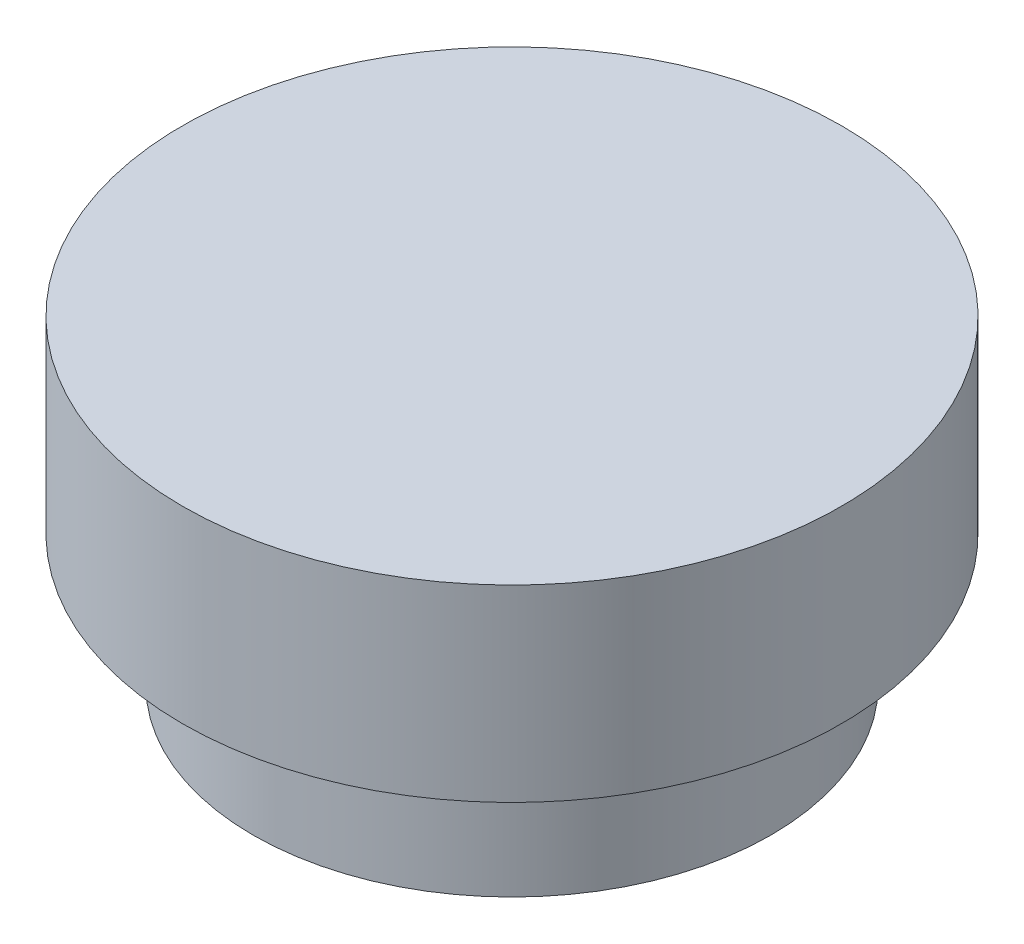
ISO-10303-21;
HEADER;
FILE_DESCRIPTION(('STEP AP214'),'2;1');
FILE_NAME('part.step','',(''),(''),'','','');
FILE_SCHEMA(('AUTOMOTIVE_DESIGN { 1 0 10303 214 1 1 1 1 }'));
ENDSEC;
DATA;
#1=APPLICATION_CONTEXT('core data for automotive mechanical design processes');
#2=APPLICATION_PROTOCOL_DEFINITION('international standard','automotive_design',2000,#1);
#3=PRODUCT_CONTEXT('',#1,'mechanical');
#4=PRODUCT('Part','Part','',(#3));
#5=PRODUCT_RELATED_PRODUCT_CATEGORY('part','',(#4));
#6=PRODUCT_DEFINITION_FORMATION('','',#4);
#7=PRODUCT_DEFINITION_CONTEXT('part definition',#1,'design');
#8=PRODUCT_DEFINITION('design','',#6,#7);
#9=PRODUCT_DEFINITION_SHAPE('','',#8);
#10=(LENGTH_UNIT() NAMED_UNIT(*) SI_UNIT(.MILLI.,.METRE.));
#11=(NAMED_UNIT(*) PLANE_ANGLE_UNIT() SI_UNIT($,.RADIAN.));
#12=(NAMED_UNIT(*) SI_UNIT($,.STERADIAN.) SOLID_ANGLE_UNIT());
#13=UNCERTAINTY_MEASURE_WITH_UNIT(LENGTH_MEASURE(1.E-05),#10,'distance_accuracy_value','');
#14=(GEOMETRIC_REPRESENTATION_CONTEXT(3) GLOBAL_UNCERTAINTY_ASSIGNED_CONTEXT((#13)) GLOBAL_UNIT_ASSIGNED_CONTEXT((#10,
#11,#12)) REPRESENTATION_CONTEXT('',''));
#15=CARTESIAN_POINT('',(0.,0.,0.));
#16=DIRECTION('',(0.,0.,1.));
#17=DIRECTION('',(1.,0.,0.));
#18=AXIS2_PLACEMENT_3D('',#15,#16,#17);
#19=CARTESIAN_POINT('',(0.,10.,0.));
#20=DIRECTION('',(0.,-1.,0.));
#21=DIRECTION('',(0.,0.,-1.));
#22=AXIS2_PLACEMENT_3D('',#19,#20,#21);
#23=CYLINDRICAL_SURFACE('',#22,5.);
#24=CARTESIAN_POINT('',(0.,10.,0.));
#25=DIRECTION('',(0.,1.,0.));
#26=DIRECTION('',(0.,0.,1.));
#27=AXIS2_PLACEMENT_3D('',#24,#25,#26);
#28=CIRCLE('',#27,5.);
#29=CARTESIAN_POINT('',(0.,10.,5.));
#30=VERTEX_POINT('',#29);
#31=EDGE_CURVE('E10',#30,#30,#28,.T.);
#32=ORIENTED_EDGE('',*,*,#31,.F.);
#33=EDGE_LOOP('',(#32));
#34=FACE_BOUND('',#33,.T.);
#35=CARTESIAN_POINT('',(0.,0.,0.));
#36=DIRECTION('',(0.,1.,0.));
#37=DIRECTION('',(0.,0.,1.));
#38=AXIS2_PLACEMENT_3D('',#35,#36,#37);
#39=CIRCLE('',#38,5.);
#40=CARTESIAN_POINT('',(0.,0.,5.));
#41=VERTEX_POINT('',#40);
#42=EDGE_CURVE('E34',#41,#41,#39,.T.);
#43=ORIENTED_EDGE('',*,*,#42,.T.);
#44=EDGE_LOOP('',(#43));
#45=FACE_BOUND('',#44,.T.);
#46=ADVANCED_FACE('F31',(#34,#45),#23,.T.);
#47=CARTESIAN_POINT('',(0.,0.,0.));
#48=DIRECTION('',(0.,1.,0.));
#49=DIRECTION('',(0.,0.,1.));
#50=AXIS2_PLACEMENT_3D('',#47,#48,#49);
#51=PLANE('',#50);
#52=ORIENTED_EDGE('',*,*,#42,.F.);
#53=EDGE_LOOP('',(#52));
#54=FACE_BOUND('',#53,.T.);
#55=ADVANCED_FACE('F73',(#54),#51,.F.);
#56=CARTESIAN_POINT('',(0.,24.,0.));
#57=DIRECTION('',(0.,-1.,0.));
#58=DIRECTION('',(0.,0.,-1.));
#59=AXIS2_PLACEMENT_3D('',#56,#57,#58);
#60=CYLINDRICAL_SURFACE('',#59,27.5);
#61=CARTESIAN_POINT('',(0.,24.,0.));
#62=DIRECTION('',(0.,1.,0.));
#63=DIRECTION('',(0.,0.,1.));
#64=AXIS2_PLACEMENT_3D('',#61,#62,#63);
#65=CIRCLE('',#64,27.5);
#66=CARTESIAN_POINT('',(0.,24.,27.5));
#67=VERTEX_POINT('',#66);
#68=EDGE_CURVE('E41',#67,#67,#65,.T.);
#69=ORIENTED_EDGE('',*,*,#68,.F.);
#70=EDGE_LOOP('',(#69));
#71=FACE_BOUND('',#70,.T.);
#72=CARTESIAN_POINT('',(0.,10.,0.));
#73=DIRECTION('',(0.,1.,0.));
#74=DIRECTION('',(0.,0.,1.));
#75=AXIS2_PLACEMENT_3D('',#72,#73,#74);
#76=CIRCLE('',#75,27.5);
#77=CARTESIAN_POINT('',(0.,10.,27.5));
#78=VERTEX_POINT('',#77);
#79=EDGE_CURVE('E43',#78,#78,#76,.T.);
#80=ORIENTED_EDGE('',*,*,#79,.T.);
#81=EDGE_LOOP('',(#80));
#82=FACE_BOUND('',#81,.T.);
#83=ADVANCED_FACE('F78',(#71,#82),#60,.T.);
#84=CARTESIAN_POINT('',(0.,10.,0.));
#85=DIRECTION('',(0.,1.,0.));
#86=DIRECTION('',(0.,0.,1.));
#87=AXIS2_PLACEMENT_3D('',#84,#85,#86);
#88=PLANE('',#87);
#89=ORIENTED_EDGE('',*,*,#31,.T.);
#90=EDGE_LOOP('',(#89));
#91=FACE_BOUND('',#90,.T.);
#92=ORIENTED_EDGE('',*,*,#79,.F.);
#93=EDGE_LOOP('',(#92));
#94=FACE_BOUND('',#93,.T.);
#95=ADVANCED_FACE('F60',(#91,#94),#88,.F.);
#96=CARTESIAN_POINT('',(0.,44.,0.));
#97=DIRECTION('',(0.,-1.,0.));
#98=DIRECTION('',(0.,0.,-1.));
#99=AXIS2_PLACEMENT_3D('',#96,#97,#98);
#100=CYLINDRICAL_SURFACE('',#99,35.);
#101=CARTESIAN_POINT('',(0.,44.,0.));
#102=DIRECTION('',(0.,1.,0.));
#103=DIRECTION('',(0.,0.,1.));
#104=AXIS2_PLACEMENT_3D('',#101,#102,#103);
#105=CIRCLE('',#104,35.);
#106=CARTESIAN_POINT('',(0.,44.,35.));
#107=VERTEX_POINT('',#106);
#108=EDGE_CURVE('E46',#107,#107,#105,.T.);
#109=ORIENTED_EDGE('',*,*,#108,.F.);
#110=EDGE_LOOP('',(#109));
#111=FACE_BOUND('',#110,.T.);
#112=CARTESIAN_POINT('',(0.,24.,0.));
#113=DIRECTION('',(0.,1.,0.));
#114=DIRECTION('',(0.,0.,1.));
#115=AXIS2_PLACEMENT_3D('',#112,#113,#114);
#116=CIRCLE('',#115,35.);
#117=CARTESIAN_POINT('',(0.,24.,35.));
#118=VERTEX_POINT('',#117);
#119=EDGE_CURVE('E49',#118,#118,#116,.T.);
#120=ORIENTED_EDGE('',*,*,#119,.T.);
#121=EDGE_LOOP('',(#120));
#122=FACE_BOUND('',#121,.T.);
#123=ADVANCED_FACE('F57',(#111,#122),#100,.T.);
#124=CARTESIAN_POINT('',(0.,44.,0.));
#125=DIRECTION('',(0.,1.,0.));
#126=DIRECTION('',(0.,0.,1.));
#127=AXIS2_PLACEMENT_3D('',#124,#125,#126);
#128=PLANE('',#127);
#129=ORIENTED_EDGE('',*,*,#108,.T.);
#130=EDGE_LOOP('',(#129));
#131=FACE_BOUND('',#130,.T.);
#132=ADVANCED_FACE('F55',(#131),#128,.T.);
#133=CARTESIAN_POINT('',(0.,24.,0.));
#134=DIRECTION('',(0.,1.,0.));
#135=DIRECTION('',(0.,0.,1.));
#136=AXIS2_PLACEMENT_3D('',#133,#134,#135);
#137=PLANE('',#136);
#138=ORIENTED_EDGE('',*,*,#68,.T.);
#139=EDGE_LOOP('',(#138));
#140=FACE_BOUND('',#139,.T.);
#141=ORIENTED_EDGE('',*,*,#119,.F.);
#142=EDGE_LOOP('',(#141));
#143=FACE_BOUND('',#142,.T.);
#144=ADVANCED_FACE('F64',(#140,#143),#137,.F.);
#145=CLOSED_SHELL('',(#46,#55,#83,#95,#123,#132,#144));
#146=MANIFOLD_SOLID_BREP('B2',#145);
#147=ADVANCED_BREP_SHAPE_REPRESENTATION('',(#18,#146),#14);
#148=SHAPE_DEFINITION_REPRESENTATION(#9,#147);
ENDSEC;
END-ISO-10303-21;
